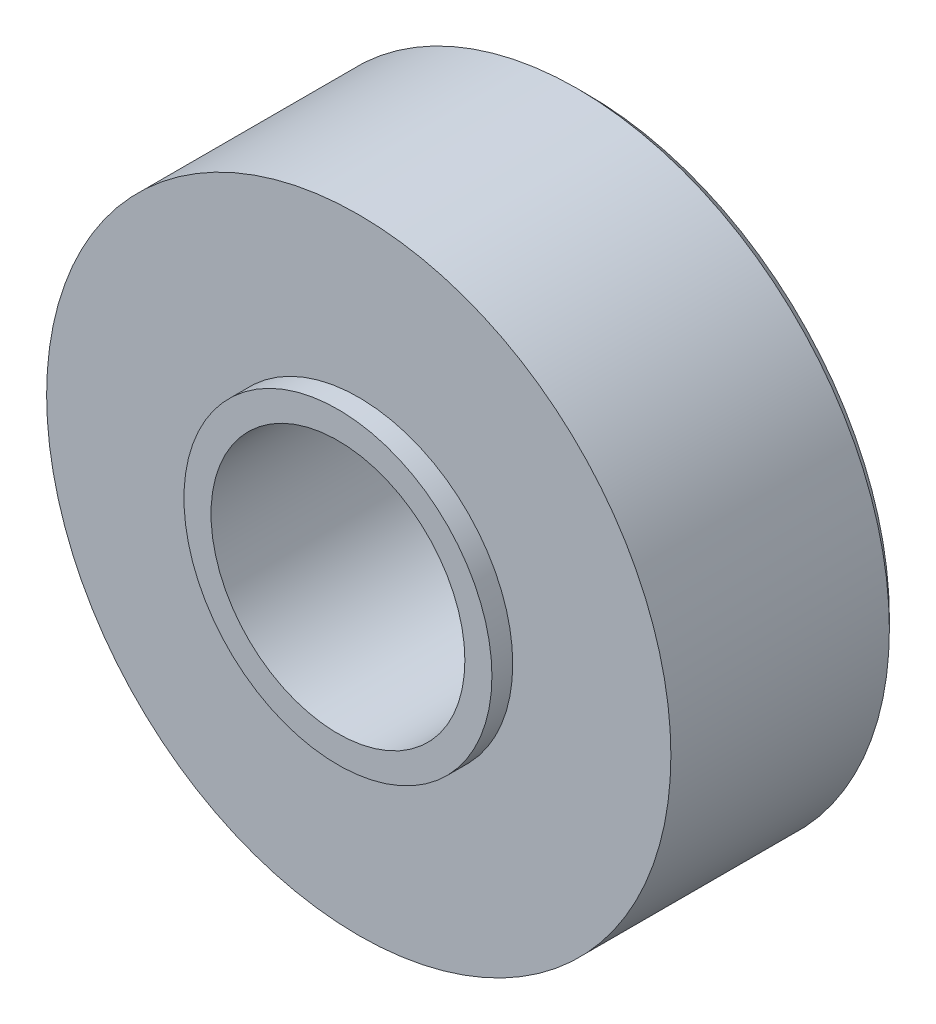
ISO-10303-21;
HEADER;
FILE_DESCRIPTION(('STEP AP214'),'2;1');
FILE_NAME('part.step','',(''),(''),'','','');
FILE_SCHEMA(('AUTOMOTIVE_DESIGN { 1 0 10303 214 1 1 1 1 }'));
ENDSEC;
DATA;
#1=APPLICATION_CONTEXT('core data for automotive mechanical design processes');
#2=APPLICATION_PROTOCOL_DEFINITION('international standard','automotive_design',2000,#1);
#3=PRODUCT_CONTEXT('',#1,'mechanical');
#4=PRODUCT('Part','Part','',(#3));
#5=PRODUCT_RELATED_PRODUCT_CATEGORY('part','',(#4));
#6=PRODUCT_DEFINITION_FORMATION('','',#4);
#7=PRODUCT_DEFINITION_CONTEXT('part definition',#1,'design');
#8=PRODUCT_DEFINITION('design','',#6,#7);
#9=PRODUCT_DEFINITION_SHAPE('','',#8);
#10=(LENGTH_UNIT() NAMED_UNIT(*) SI_UNIT(.MILLI.,.METRE.));
#11=(NAMED_UNIT(*) PLANE_ANGLE_UNIT() SI_UNIT($,.RADIAN.));
#12=(NAMED_UNIT(*) SI_UNIT($,.STERADIAN.) SOLID_ANGLE_UNIT());
#13=UNCERTAINTY_MEASURE_WITH_UNIT(LENGTH_MEASURE(1.E-05),#10,'distance_accuracy_value','');
#14=(GEOMETRIC_REPRESENTATION_CONTEXT(3) GLOBAL_UNCERTAINTY_ASSIGNED_CONTEXT((#13)) GLOBAL_UNIT_ASSIGNED_CONTEXT((#10,
#11,#12)) REPRESENTATION_CONTEXT('',''));
#15=CARTESIAN_POINT('',(0.,0.,0.));
#16=DIRECTION('',(0.,0.,1.));
#17=DIRECTION('',(1.,0.,0.));
#18=AXIS2_PLACEMENT_3D('',#15,#16,#17);
#19=CARTESIAN_POINT('',(0.,0.,5.5));
#20=DIRECTION('',(0.,0.,1.));
#21=DIRECTION('',(1.,0.,0.));
#22=AXIS2_PLACEMENT_3D('',#19,#20,#21);
#23=PLANE('',#22);
#24=CARTESIAN_POINT('',(0.,0.,5.5));
#25=DIRECTION('',(0.,0.,1.));
#26=DIRECTION('',(1.,0.,0.));
#27=AXIS2_PLACEMENT_3D('',#24,#25,#26);
#28=CIRCLE('',#27,7.5);
#29=CARTESIAN_POINT('',(7.5,0.,5.5));
#30=VERTEX_POINT('',#29);
#31=EDGE_CURVE('E64',#30,#30,#28,.T.);
#32=ORIENTED_EDGE('',*,*,#31,.T.);
#33=EDGE_LOOP('',(#32));
#34=FACE_BOUND('',#33,.T.);
#35=CARTESIAN_POINT('',(0.,0.,5.5));
#36=DIRECTION('',(0.,0.,1.));
#37=DIRECTION('',(1.,0.,0.));
#38=AXIS2_PLACEMENT_3D('',#35,#36,#37);
#39=CIRCLE('',#38,3.7);
#40=CARTESIAN_POINT('',(3.7,0.,5.5));
#41=VERTEX_POINT('',#40);
#42=EDGE_CURVE('E69',#41,#41,#39,.T.);
#43=ORIENTED_EDGE('',*,*,#42,.F.);
#44=EDGE_LOOP('',(#43));
#45=FACE_BOUND('',#44,.T.);
#46=ADVANCED_FACE('F39',(#34,#45),#23,.T.);
#47=CARTESIAN_POINT('',(0.,0.,0.));
#48=DIRECTION('',(0.,0.,1.));
#49=DIRECTION('',(1.,0.,0.));
#50=AXIS2_PLACEMENT_3D('',#47,#48,#49);
#51=PLANE('',#50);
#52=CARTESIAN_POINT('',(0.,0.,0.));
#53=DIRECTION('',(0.,0.,1.));
#54=DIRECTION('',(1.,0.,0.));
#55=AXIS2_PLACEMENT_3D('',#52,#53,#54);
#56=CIRCLE('',#55,3.3);
#57=CARTESIAN_POINT('',(3.3,0.,0.));
#58=VERTEX_POINT('',#57);
#59=EDGE_CURVE('E53',#58,#58,#56,.T.);
#60=ORIENTED_EDGE('',*,*,#59,.T.);
#61=EDGE_LOOP('',(#60));
#62=FACE_BOUND('',#61,.T.);
#63=CARTESIAN_POINT('',(0.,0.,0.));
#64=DIRECTION('',(0.,0.,1.));
#65=DIRECTION('',(1.,0.,0.));
#66=AXIS2_PLACEMENT_3D('',#63,#64,#65);
#67=CIRCLE('',#66,7.25);
#68=CARTESIAN_POINT('',(7.25,0.,0.));
#69=VERTEX_POINT('',#68);
#70=EDGE_CURVE('E58',#69,#69,#67,.F.);
#71=ORIENTED_EDGE('',*,*,#70,.T.);
#72=EDGE_LOOP('',(#71));
#73=FACE_BOUND('',#72,.T.);
#74=ADVANCED_FACE('F98',(#62,#73),#51,.F.);
#75=CARTESIAN_POINT('',(0.,0.,5.5));
#76=DIRECTION('',(0.,0.,-1.));
#77=DIRECTION('',(-1.,0.,0.));
#78=AXIS2_PLACEMENT_3D('',#75,#76,#77);
#79=CYLINDRICAL_SURFACE('',#78,7.5);
#80=CARTESIAN_POINT('',(0.,0.,0.250000000000002));
#81=DIRECTION('',(0.,0.,1.));
#82=DIRECTION('',(1.,0.,0.));
#83=AXIS2_PLACEMENT_3D('',#80,#81,#82);
#84=CIRCLE('',#83,7.5);
#85=CARTESIAN_POINT('',(7.5,0.,0.250000000000002));
#86=VERTEX_POINT('',#85);
#87=EDGE_CURVE('E10',#86,#86,#84,.T.);
#88=ORIENTED_EDGE('',*,*,#87,.T.);
#89=EDGE_LOOP('',(#88));
#90=FACE_BOUND('',#89,.T.);
#91=ORIENTED_EDGE('',*,*,#31,.F.);
#92=EDGE_LOOP('',(#91));
#93=FACE_BOUND('',#92,.T.);
#94=ADVANCED_FACE('F95',(#90,#93),#79,.T.);
#95=CARTESIAN_POINT('',(0.,0.,5.5));
#96=DIRECTION('',(0.,0.,-1.));
#97=DIRECTION('',(-1.,0.,0.));
#98=AXIS2_PLACEMENT_3D('',#95,#96,#97);
#99=CYLINDRICAL_SURFACE('',#98,3.05);
#100=CARTESIAN_POINT('',(0.,0.,0.249999999999999));
#101=DIRECTION('',(0.,0.,1.));
#102=DIRECTION('',(1.,0.,0.));
#103=AXIS2_PLACEMENT_3D('',#100,#101,#102);
#104=CIRCLE('',#103,3.05);
#105=CARTESIAN_POINT('',(3.05,0.,0.249999999999999));
#106=VERTEX_POINT('',#105);
#107=EDGE_CURVE('E48',#106,#106,#104,.F.);
#108=ORIENTED_EDGE('',*,*,#107,.T.);
#109=EDGE_LOOP('',(#108));
#110=FACE_BOUND('',#109,.T.);
#111=CARTESIAN_POINT('',(0.,0.,6.));
#112=DIRECTION('',(0.,0.,1.));
#113=DIRECTION('',(1.,0.,0.));
#114=AXIS2_PLACEMENT_3D('',#111,#112,#113);
#115=CIRCLE('',#114,3.05);
#116=CARTESIAN_POINT('',(3.05,0.,6.));
#117=VERTEX_POINT('',#116);
#118=EDGE_CURVE('E73',#117,#117,#115,.T.);
#119=ORIENTED_EDGE('',*,*,#118,.T.);
#120=EDGE_LOOP('',(#119));
#121=FACE_BOUND('',#120,.T.);
#122=ADVANCED_FACE('F81',(#110,#121),#99,.F.);
#123=CARTESIAN_POINT('',(0.,0.,6.));
#124=DIRECTION('',(0.,0.,1.));
#125=DIRECTION('',(1.,0.,0.));
#126=AXIS2_PLACEMENT_3D('',#123,#124,#125);
#127=PLANE('',#126);
#128=CARTESIAN_POINT('',(0.,0.,6.));
#129=DIRECTION('',(0.,0.,1.));
#130=DIRECTION('',(1.,0.,0.));
#131=AXIS2_PLACEMENT_3D('',#128,#129,#130);
#132=CIRCLE('',#131,3.7);
#133=CARTESIAN_POINT('',(3.7,0.,6.));
#134=VERTEX_POINT('',#133);
#135=EDGE_CURVE('E68',#134,#134,#132,.T.);
#136=ORIENTED_EDGE('',*,*,#135,.T.);
#137=EDGE_LOOP('',(#136));
#138=FACE_BOUND('',#137,.T.);
#139=ORIENTED_EDGE('',*,*,#118,.F.);
#140=EDGE_LOOP('',(#139));
#141=FACE_BOUND('',#140,.T.);
#142=ADVANCED_FACE('F83',(#138,#141),#127,.T.);
#143=CARTESIAN_POINT('',(0.,0.,6.));
#144=DIRECTION('',(0.,0.,-1.));
#145=DIRECTION('',(-1.,0.,0.));
#146=AXIS2_PLACEMENT_3D('',#143,#144,#145);
#147=CYLINDRICAL_SURFACE('',#146,3.7);
#148=ORIENTED_EDGE('',*,*,#135,.F.);
#149=EDGE_LOOP('',(#148));
#150=FACE_BOUND('',#149,.T.);
#151=ORIENTED_EDGE('',*,*,#42,.T.);
#152=EDGE_LOOP('',(#151));
#153=FACE_BOUND('',#152,.T.);
#154=ADVANCED_FACE('F85',(#150,#153),#147,.T.);
#155=CARTESIAN_POINT('',(0.,0.,0.));
#156=DIRECTION('',(0.,0.,-1.));
#157=DIRECTION('',(-1.,0.,0.));
#158=AXIS2_PLACEMENT_3D('',#155,#156,#157);
#159=CONICAL_SURFACE('',#158,3.3,0.785398163397441);
#160=ORIENTED_EDGE('',*,*,#107,.F.);
#161=EDGE_LOOP('',(#160));
#162=FACE_BOUND('',#161,.T.);
#163=ORIENTED_EDGE('',*,*,#59,.F.);
#164=EDGE_LOOP('',(#163));
#165=FACE_BOUND('',#164,.T.);
#166=ADVANCED_FACE('F92',(#162,#165),#159,.F.);
#167=CARTESIAN_POINT('',(0.,0.,0.250000000000002));
#168=DIRECTION('',(0.,0.,1.));
#169=DIRECTION('',(1.,0.,0.));
#170=AXIS2_PLACEMENT_3D('',#167,#168,#169);
#171=CONICAL_SURFACE('',#170,7.5,0.78539816339745);
#172=ORIENTED_EDGE('',*,*,#70,.F.);
#173=EDGE_LOOP('',(#172));
#174=FACE_BOUND('',#173,.T.);
#175=ORIENTED_EDGE('',*,*,#87,.F.);
#176=EDGE_LOOP('',(#175));
#177=FACE_BOUND('',#176,.T.);
#178=ADVANCED_FACE('F42',(#174,#177),#171,.T.);
#179=CLOSED_SHELL('',(#46,#74,#94,#122,#142,#154,#166,#178));
#180=MANIFOLD_SOLID_BREP('B2',#179);
#181=ADVANCED_BREP_SHAPE_REPRESENTATION('',(#18,#180),#14);
#182=SHAPE_DEFINITION_REPRESENTATION(#9,#181);
ENDSEC;
END-ISO-10303-21;
